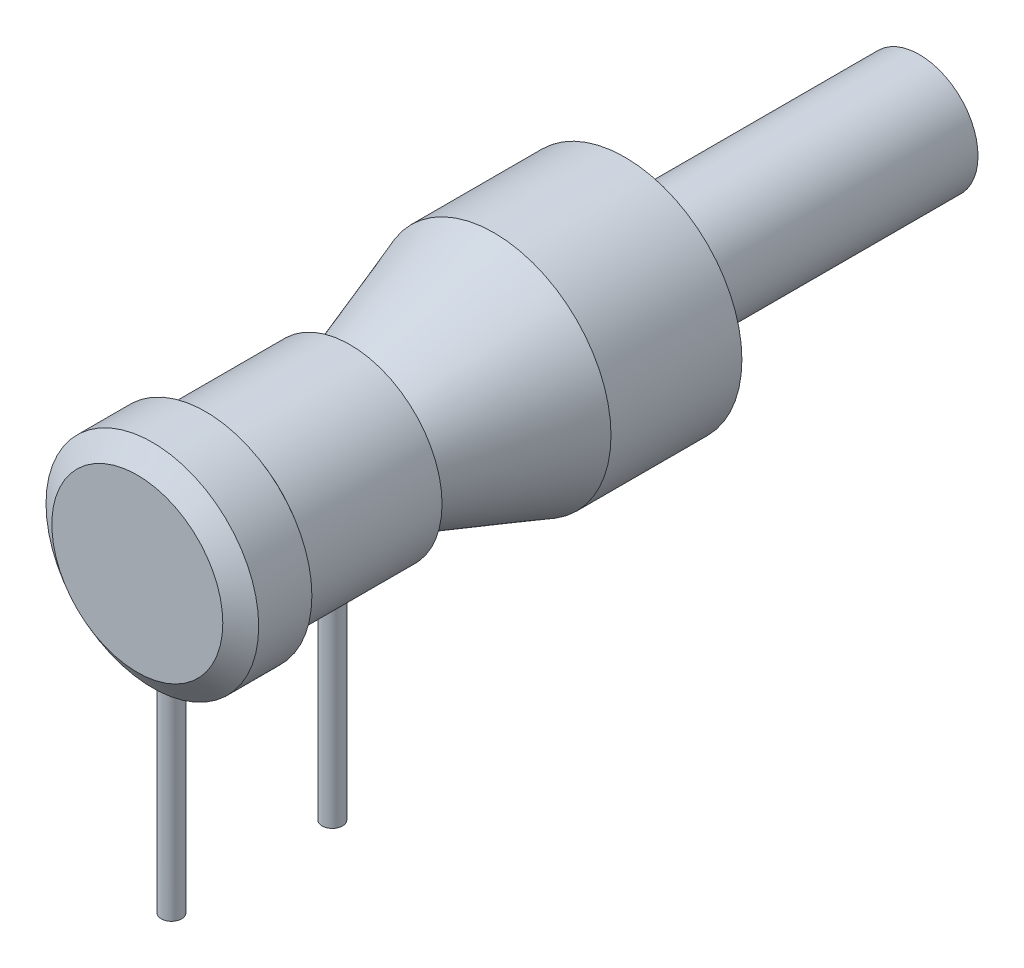
ISO-10303-21;
HEADER;
FILE_DESCRIPTION(('STEP AP214'),'2;1');
FILE_NAME('part.step','',(''),(''),'','','');
FILE_SCHEMA(('AUTOMOTIVE_DESIGN { 1 0 10303 214 1 1 1 1 }'));
ENDSEC;
DATA;
#1=APPLICATION_CONTEXT('core data for automotive mechanical design processes');
#2=APPLICATION_PROTOCOL_DEFINITION('international standard','automotive_design',2000,#1);
#3=PRODUCT_CONTEXT('',#1,'mechanical');
#4=PRODUCT('Part','Part','',(#3));
#5=PRODUCT_RELATED_PRODUCT_CATEGORY('part','',(#4));
#6=PRODUCT_DEFINITION_FORMATION('','',#4);
#7=PRODUCT_DEFINITION_CONTEXT('part definition',#1,'design');
#8=PRODUCT_DEFINITION('design','',#6,#7);
#9=PRODUCT_DEFINITION_SHAPE('','',#8);
#10=(LENGTH_UNIT() NAMED_UNIT(*) SI_UNIT(.MILLI.,.METRE.));
#11=(NAMED_UNIT(*) PLANE_ANGLE_UNIT() SI_UNIT($,.RADIAN.));
#12=(NAMED_UNIT(*) SI_UNIT($,.STERADIAN.) SOLID_ANGLE_UNIT());
#13=UNCERTAINTY_MEASURE_WITH_UNIT(LENGTH_MEASURE(1.E-05),#10,'distance_accuracy_value','');
#14=(GEOMETRIC_REPRESENTATION_CONTEXT(3) GLOBAL_UNCERTAINTY_ASSIGNED_CONTEXT((#13)) GLOBAL_UNIT_ASSIGNED_CONTEXT((#10,
#11,#12)) REPRESENTATION_CONTEXT('',''));
#15=CARTESIAN_POINT('',(0.,0.,0.));
#16=DIRECTION('',(0.,0.,1.));
#17=DIRECTION('',(1.,0.,0.));
#18=AXIS2_PLACEMENT_3D('',#15,#16,#17);
#19=CARTESIAN_POINT('',(0.,-1.97874677833909E-13,74.5));
#20=DIRECTION('',(0.,0.,-1.));
#21=DIRECTION('',(-1.,0.,0.));
#22=AXIS2_PLACEMENT_3D('',#19,#20,#21);
#23=PLANE('',#22);
#24=CARTESIAN_POINT('',(0.,0.,74.5));
#25=DIRECTION('',(0.,0.,1.));
#26=DIRECTION('',(1.,0.,0.));
#27=AXIS2_PLACEMENT_3D('',#24,#25,#26);
#28=CIRCLE('',#27,5.225);
#29=CARTESIAN_POINT('',(5.225,0.,74.5));
#30=VERTEX_POINT('',#29);
#31=EDGE_CURVE('E67',#30,#30,#28,.T.);
#32=ORIENTED_EDGE('',*,*,#31,.T.);
#33=EDGE_LOOP('',(#32));
#34=FACE_BOUND('',#33,.T.);
#35=ADVANCED_FACE('F39',(#34),#23,.F.);
#36=CARTESIAN_POINT('',(0.,0.,26.7));
#37=DIRECTION('',(0.,0.,-1.));
#38=DIRECTION('',(-1.,0.,0.));
#39=AXIS2_PLACEMENT_3D('',#36,#37,#38);
#40=PLANE('',#39);
#41=CARTESIAN_POINT('',(0.,0.,26.7));
#42=DIRECTION('',(0.,0.,1.));
#43=DIRECTION('',(1.,0.,0.));
#44=AXIS2_PLACEMENT_3D('',#41,#42,#43);
#45=CIRCLE('',#44,3.58);
#46=CARTESIAN_POINT('',(3.58,0.,26.7));
#47=VERTEX_POINT('',#46);
#48=EDGE_CURVE('E10',#47,#47,#45,.T.);
#49=ORIENTED_EDGE('',*,*,#48,.F.);
#50=EDGE_LOOP('',(#49));
#51=FACE_BOUND('',#50,.T.);
#52=ADVANCED_FACE('F98',(#51),#40,.T.);
#53=CARTESIAN_POINT('',(0.,0.,178.397679784071));
#54=DIRECTION('',(0.,0.,1.));
#55=DIRECTION('',(1.,0.,0.));
#56=AXIS2_PLACEMENT_3D('',#53,#54,#55);
#57=CYLINDRICAL_SURFACE('',#56,3.58);
#58=CARTESIAN_POINT('',(0.,0.,42.7));
#59=DIRECTION('',(0.,0.,1.));
#60=DIRECTION('',(1.,0.,0.));
#61=AXIS2_PLACEMENT_3D('',#58,#59,#60);
#62=CIRCLE('',#61,3.58);
#63=CARTESIAN_POINT('',(3.58,0.,42.7));
#64=VERTEX_POINT('',#63);
#65=EDGE_CURVE('E51',#64,#64,#62,.T.);
#66=ORIENTED_EDGE('',*,*,#65,.F.);
#67=EDGE_LOOP('',(#66));
#68=FACE_BOUND('',#67,.T.);
#69=ORIENTED_EDGE('',*,*,#48,.T.);
#70=EDGE_LOOP('',(#69));
#71=FACE_BOUND('',#70,.T.);
#72=ADVANCED_FACE('F103',(#68,#71),#57,.T.);
#73=CARTESIAN_POINT('',(0.,0.,42.7));
#74=DIRECTION('',(0.,0.,-1.));
#75=DIRECTION('',(-1.,0.,0.));
#76=AXIS2_PLACEMENT_3D('',#73,#74,#75);
#77=PLANE('',#76);
#78=CARTESIAN_POINT('',(0.,0.,42.7));
#79=DIRECTION('',(0.,0.,1.));
#80=DIRECTION('',(1.,0.,0.));
#81=AXIS2_PLACEMENT_3D('',#78,#79,#80);
#82=CIRCLE('',#81,2.25);
#83=CARTESIAN_POINT('',(2.25,0.,42.7));
#84=VERTEX_POINT('',#83);
#85=EDGE_CURVE('E58',#84,#84,#82,.T.);
#86=ORIENTED_EDGE('',*,*,#85,.F.);
#87=EDGE_LOOP('',(#86));
#88=FACE_BOUND('',#87,.T.);
#89=ORIENTED_EDGE('',*,*,#65,.T.);
#90=EDGE_LOOP('',(#89));
#91=FACE_BOUND('',#90,.T.);
#92=ADVANCED_FACE('F140',(#88,#91),#77,.F.);
#93=CARTESIAN_POINT('',(0.,0.,178.397679784071));
#94=DIRECTION('',(0.,0.,1.));
#95=DIRECTION('',(1.,0.,0.));
#96=AXIS2_PLACEMENT_3D('',#93,#94,#95);
#97=CYLINDRICAL_SURFACE('',#96,2.25);
#98=ORIENTED_EDGE('',*,*,#85,.T.);
#99=EDGE_LOOP('',(#98));
#100=FACE_BOUND('',#99,.T.);
#101=CARTESIAN_POINT('',(0.,0.,44.7));
#102=DIRECTION('',(0.,0.,1.));
#103=DIRECTION('',(1.,0.,0.));
#104=AXIS2_PLACEMENT_3D('',#101,#102,#103);
#105=CIRCLE('',#104,2.25);
#106=CARTESIAN_POINT('',(2.25,0.,44.7));
#107=VERTEX_POINT('',#106);
#108=EDGE_CURVE('E132',#107,#107,#105,.T.);
#109=ORIENTED_EDGE('',*,*,#108,.F.);
#110=EDGE_LOOP('',(#109));
#111=FACE_BOUND('',#110,.T.);
#112=ADVANCED_FACE('F137',(#100,#111),#97,.T.);
#113=CARTESIAN_POINT('',(0.,0.,44.7));
#114=DIRECTION('',(0.,0.,-1.));
#115=DIRECTION('',(-1.,0.,0.));
#116=AXIS2_PLACEMENT_3D('',#113,#114,#115);
#117=PLANE('',#116);
#118=ORIENTED_EDGE('',*,*,#108,.T.);
#119=EDGE_LOOP('',(#118));
#120=FACE_BOUND('',#119,.T.);
#121=CARTESIAN_POINT('',(0.,0.,44.7));
#122=DIRECTION('',(0.,0.,1.));
#123=DIRECTION('',(1.,0.,0.));
#124=AXIS2_PLACEMENT_3D('',#121,#122,#123);
#125=CIRCLE('',#124,7.15);
#126=CARTESIAN_POINT('',(7.15,0.,44.7));
#127=VERTEX_POINT('',#126);
#128=EDGE_CURVE('E129',#127,#127,#125,.T.);
#129=ORIENTED_EDGE('',*,*,#128,.F.);
#130=EDGE_LOOP('',(#129));
#131=FACE_BOUND('',#130,.T.);
#132=ADVANCED_FACE('F153',(#120,#131),#117,.T.);
#133=CARTESIAN_POINT('',(0.,0.,178.397679784071));
#134=DIRECTION('',(0.,0.,1.));
#135=DIRECTION('',(1.,0.,0.));
#136=AXIS2_PLACEMENT_3D('',#133,#134,#135);
#137=CYLINDRICAL_SURFACE('',#136,7.15);
#138=ORIENTED_EDGE('',*,*,#128,.T.);
#139=EDGE_LOOP('',(#138));
#140=FACE_BOUND('',#139,.T.);
#141=CARTESIAN_POINT('',(0.,0.,52.7));
#142=DIRECTION('',(0.,0.,1.));
#143=DIRECTION('',(1.,0.,0.));
#144=AXIS2_PLACEMENT_3D('',#141,#142,#143);
#145=CIRCLE('',#144,7.15000000000001);
#146=CARTESIAN_POINT('',(7.15000000000001,0.,52.7));
#147=VERTEX_POINT('',#146);
#148=EDGE_CURVE('E126',#147,#147,#145,.T.);
#149=ORIENTED_EDGE('',*,*,#148,.F.);
#150=EDGE_LOOP('',(#149));
#151=FACE_BOUND('',#150,.T.);
#152=ADVANCED_FACE('F156',(#140,#151),#137,.T.);
#153=CARTESIAN_POINT('',(0.,0.,61.5));
#154=DIRECTION('',(0.,0.,-1.));
#155=DIRECTION('',(-1.,0.,0.));
#156=AXIS2_PLACEMENT_3D('',#153,#154,#155);
#157=CONICAL_SURFACE('',#156,4.1,0.333634544994301);
#158=ORIENTED_EDGE('',*,*,#148,.T.);
#159=EDGE_LOOP('',(#158));
#160=FACE_BOUND('',#159,.T.);
#161=CARTESIAN_POINT('',(0.,0.,61.5));
#162=DIRECTION('',(0.,0.,1.));
#163=DIRECTION('',(1.,0.,0.));
#164=AXIS2_PLACEMENT_3D('',#161,#162,#163);
#165=CIRCLE('',#164,4.1);
#166=CARTESIAN_POINT('',(4.1,0.,61.5));
#167=VERTEX_POINT('',#166);
#168=EDGE_CURVE('E123',#167,#167,#165,.T.);
#169=ORIENTED_EDGE('',*,*,#168,.F.);
#170=EDGE_LOOP('',(#169));
#171=FACE_BOUND('',#170,.T.);
#172=ADVANCED_FACE('F160',(#160,#171),#157,.T.);
#173=CARTESIAN_POINT('',(0.,2.79830803337898E-13,61.5));
#174=DIRECTION('',(0.,0.,1.));
#175=DIRECTION('',(1.,0.,0.));
#176=AXIS2_PLACEMENT_3D('',#173,#174,#175);
#177=PLANE('',#176);
#178=CARTESIAN_POINT('',(0.,0.,61.5));
#179=DIRECTION('',(0.,0.,1.));
#180=DIRECTION('',(1.,0.,0.));
#181=AXIS2_PLACEMENT_3D('',#178,#179,#180);
#182=CIRCLE('',#181,5.625);
#183=CARTESIAN_POINT('',(5.625,0.,61.5));
#184=VERTEX_POINT('',#183);
#185=EDGE_CURVE('E120',#184,#184,#182,.T.);
#186=ORIENTED_EDGE('',*,*,#185,.F.);
#187=EDGE_LOOP('',(#186));
#188=FACE_BOUND('',#187,.T.);
#189=ORIENTED_EDGE('',*,*,#168,.T.);
#190=EDGE_LOOP('',(#189));
#191=FACE_BOUND('',#190,.T.);
#192=ADVANCED_FACE('F93',(#188,#191),#177,.F.);
#193=CARTESIAN_POINT('',(0.,0.,178.397679784071));
#194=DIRECTION('',(0.,0.,1.));
#195=DIRECTION('',(1.,0.,0.));
#196=AXIS2_PLACEMENT_3D('',#193,#194,#195);
#197=CYLINDRICAL_SURFACE('',#196,5.625);
#198=CARTESIAN_POINT('',(0.,-5.625,63.2055494612907));
#199=CARTESIAN_POINT('',(0.0349908226092249,-5.62499955798236,63.2055479572822));
#200=CARTESIAN_POINT('',(0.070004250927972,-5.62467004409525,63.2026011034454));
#201=CARTESIAN_POINT('',(0.139058898077095,-5.6233872373631,63.1908908586582));
#202=CARTESIAN_POINT('',(0.173099027849309,-5.62243327227234,63.1821211990873));
#203=CARTESIAN_POINT('',(0.239197212209467,-5.62000915856009,63.1590251002963));
#204=CARTESIAN_POINT('',(0.271256506480509,-5.61853933670987,63.1447021782096));
#205=CARTESIAN_POINT('',(0.332509540656205,-5.61524749408966,63.1109133318537));
#206=CARTESIAN_POINT('',(0.361703816167155,-5.61342553933965,63.0914483713941));
#207=CARTESIAN_POINT('',(0.416533049209455,-5.60962428693299,63.0478363206257));
#208=CARTESIAN_POINT('',(0.442153618606902,-5.60764440098013,63.023671191023));
#209=CARTESIAN_POINT('',(0.488984386593904,-5.60375524476677,62.9713833750293));
#210=CARTESIAN_POINT('',(0.510194372810079,-5.60184597791027,62.9432604981787));
#211=CARTESIAN_POINT('',(0.547654068175719,-5.59830833734177,62.8837638587188));
#212=CARTESIAN_POINT('',(0.563890548569808,-5.59668071767983,62.8523817184627));
#213=CARTESIAN_POINT('',(0.590857868127484,-5.59389818136035,62.787315254826));
#214=CARTESIAN_POINT('',(0.601588873443673,-5.59274325043749,62.753631000957));
#215=CARTESIAN_POINT('',(0.617197482789511,-5.59104232572351,62.6850644619581));
#216=CARTESIAN_POINT('',(0.622099155756928,-5.59049382867092,62.6501877190811));
#217=CARTESIAN_POINT('',(0.625984393760957,-5.59006015831635,62.5801026294688));
#218=CARTESIAN_POINT('',(0.62496814863901,-5.59017496373623,62.544894293407));
#219=CARTESIAN_POINT('',(0.61706620133719,-5.59105263781687,62.4753121253621));
#220=CARTESIAN_POINT('',(0.610206875540539,-5.59181259413467,62.4409352560799));
#221=CARTESIAN_POINT('',(0.590854566117779,-5.59389039741689,62.3738236408567));
#222=CARTESIAN_POINT('',(0.578361490406725,-5.59520825350031,62.3410889217668));
#223=CARTESIAN_POINT('',(0.548067518998285,-5.59825670078246,62.2781080790522));
#224=CARTESIAN_POINT('',(0.530255021504622,-5.59998819246254,62.2478675812858));
#225=CARTESIAN_POINT('',(0.489836158323981,-5.60366808509973,62.1907951954373));
#226=CARTESIAN_POINT('',(0.46722961930248,-5.60561649389853,62.1639634306584));
#227=CARTESIAN_POINT('',(0.417717546543613,-5.60952365306027,62.1143169661943));
#228=CARTESIAN_POINT('',(0.390789251771329,-5.61148240190408,62.091524959658));
#229=CARTESIAN_POINT('',(0.3334768187378,-5.61517955344319,62.0507812170181));
#230=CARTESIAN_POINT('',(0.303092675086573,-5.6169179557948,62.0328294884639));
#231=CARTESIAN_POINT('',(0.239714573604846,-5.619979315706,62.0022764098017));
#232=CARTESIAN_POINT('',(0.206720001500533,-5.62130217511578,61.989676323486));
#233=CARTESIAN_POINT('',(0.139065548637299,-5.62338245156652,61.9702014065902));
#234=CARTESIAN_POINT('',(0.104405729455595,-5.62413988949844,61.9633263644825));
#235=CARTESIAN_POINT('',(0.0346010412169575,-5.62500128457988,61.955525742004));
#236=CARTESIAN_POINT('',(-0.000540290278405599,-5.62510867875279,61.9545688694794));
#237=CARTESIAN_POINT('',(-0.070482808964739,-5.62466712876343,61.958549396451));
#238=CARTESIAN_POINT('',(-0.105284001841038,-5.62411819559048,61.9634866972573));
#239=CARTESIAN_POINT('',(-0.173467206069793,-5.62242784165784,61.9790894426832));
#240=CARTESIAN_POINT('',(-0.206852637050577,-5.6212879482682,61.9897401232024));
#241=CARTESIAN_POINT('',(-0.271363209414658,-5.61854343856761,62.0164520480807));
#242=CARTESIAN_POINT('',(-0.302488288997594,-5.61693880955629,62.0325134403067));
#243=CARTESIAN_POINT('',(-0.361735395349206,-5.61343549063211,62.0696676772504));
#244=CARTESIAN_POINT('',(-0.389844541059695,-5.61153561813629,62.0907809490844));
#245=CARTESIAN_POINT('',(-0.442131198375686,-5.60765848704489,62.1374104920202));
#246=CARTESIAN_POINT('',(-0.466308587548617,-5.60568122604187,62.1629269001821));
#247=CARTESIAN_POINT('',(-0.510155070102551,-5.60186171376125,62.2177754891239));
#248=CARTESIAN_POINT('',(-0.529803539181003,-5.60002010513343,62.2471242083152));
#249=CARTESIAN_POINT('',(-0.563892362515651,-5.59669054022848,62.3087232998821));
#250=CARTESIAN_POINT('',(-0.578332802187735,-5.5952025781514,62.3409736246582));
#251=CARTESIAN_POINT('',(-0.601561600316074,-5.59275296320827,62.4073914796397));
#252=CARTESIAN_POINT('',(-0.610361960878524,-5.5917901933861,62.4415547693368));
#253=CARTESIAN_POINT('',(-0.62209961802124,-5.59049662367049,62.51088544496));
#254=CARTESIAN_POINT('',(-0.625037126002046,-5.59016580099056,62.5460527946355));
#255=CARTESIAN_POINT('',(-0.624962366692746,-5.59017414327079,62.6161882597485));
#256=CARTESIAN_POINT('',(-0.621982497009557,-5.59050966002772,62.6511564146285));
#257=CARTESIAN_POINT('',(-0.610225781501503,-5.59180507174084,62.7200918795174));
#258=CARTESIAN_POINT('',(-0.601448931364732,-5.59276496716146,62.754059188782));
#259=CARTESIAN_POINT('',(-0.578356847695511,-5.59519992034723,62.8200268083248));
#260=CARTESIAN_POINT('',(-0.564042824806855,-5.59667486549539,62.8520275468018));
#261=CARTESIAN_POINT('',(-0.530285964960163,-5.59997394125645,62.9131777404933));
#262=CARTESIAN_POINT('',(-0.510843117574251,-5.6017980725793,62.9423271899104));
#263=CARTESIAN_POINT('',(-0.467259360167837,-5.60560196231319,62.9971132882052));
#264=CARTESIAN_POINT('',(-0.44309428406349,-5.60758248861688,63.0227306598769));
#265=CARTESIAN_POINT('',(-0.390801310151285,-5.61146908169291,63.0695600463566));
#266=CARTESIAN_POINT('',(-0.362672471127032,-5.6133751306425,63.0907710118717));
#267=CARTESIAN_POINT('',(-0.303154527117145,-5.61690422530215,63.1282383145251));
#268=CARTESIAN_POINT('',(-0.271755764505024,-5.61852639245963,63.1444793830816));
#269=CARTESIAN_POINT('',(-0.20667765473788,-5.62129573572989,63.1714361776797));
#270=CARTESIAN_POINT('',(-0.173000887482635,-5.62244343904236,63.1821580396452));
#271=CARTESIAN_POINT('',(-0.115950074785185,-5.62385101726845,63.1951429492488));
#272=CARTESIAN_POINT('',(-0.0929387921441738,-5.62427983937615,63.199039945178));
#273=CARTESIAN_POINT('',(-0.0466216843445947,-5.62485447724675,63.2042436953107));
#274=CARTESIAN_POINT('',(-0.0233158607742202,-5.62500029453499,63.205550463475));
#275=CARTESIAN_POINT('',(0.,-5.625,63.2055494612907));
#276=B_SPLINE_CURVE_WITH_KNOTS('',3,(#198,#199,#200,#201,#202,#203,#204,#205,#206,#207,#208,
#209,#210,#211,#212,#213,#214,#215,#216,#217,#218,#219,#220,#221,#222,#223,#224,#225,#226,#227,
#228,#229,#230,#231,#232,#233,#234,#235,#236,#237,#238,#239,#240,#241,#242,#243,#244,#245,#246,
#247,#248,#249,#250,#251,#252,#253,#254,#255,#256,#257,#258,#259,#260,#261,#262,#263,#264,#265,
#266,#267,#268,#269,#270,#271,#272,#273,#274,#275),.UNSPECIFIED.,.T.,.F.,(4,2,2,2,2,2,2,2,2,2,2,
2,2,2,2,2,2,2,2,2,2,2,2,2,2,2,2,2,2,2,2,2,2,2,2,2,2,2,4),(0.,0.104887316959628,
0.209887735262184,0.314821760375238,0.419736130880362,0.525061405576138,0.630391750600922,
0.735999872831949,0.841604807672926,0.946772175688268,1.05193617004848,1.1566279416973,
1.26132142461932,1.36624493541567,1.47117224049881,1.57667147666654,1.6821708773805,
1.78769517798315,1.89321557952533,1.99817756459502,2.10313779224162,2.20782808674814,
2.31252124251959,2.41764509652388,2.52277222339619,2.62836902674331,2.7339640981388,
2.83933371016292,2.94469952274044,3.04949004856204,3.15428065232898,3.25904835768518,
3.36381627605569,3.46913509208248,3.57447895889155,3.68014328839558,3.78568989152487,
3.85558111093266,3.92547195364087),.UNSPECIFIED.);
#277=CARTESIAN_POINT('',(0.,-5.625,63.2055494612907));
#278=VERTEX_POINT('',#277);
#279=EDGE_CURVE('E61',#278,#278,#276,.T.);
#280=ORIENTED_EDGE('',*,*,#279,.T.);
#281=EDGE_LOOP('',(#280));
#282=FACE_BOUND('',#281,.T.);
#283=CARTESIAN_POINT('',(0.,0.,69.7));
#284=DIRECTION('',(0.,0.,1.));
#285=DIRECTION('',(1.,0.,0.));
#286=AXIS2_PLACEMENT_3D('',#283,#284,#285);
#287=CIRCLE('',#286,5.625);
#288=CARTESIAN_POINT('',(5.625,0.,69.7));
#289=VERTEX_POINT('',#288);
#290=EDGE_CURVE('E117',#289,#289,#287,.T.);
#291=ORIENTED_EDGE('',*,*,#290,.F.);
#292=EDGE_LOOP('',(#291));
#293=FACE_BOUND('',#292,.T.);
#294=ORIENTED_EDGE('',*,*,#185,.T.);
#295=EDGE_LOOP('',(#294));
#296=FACE_BOUND('',#295,.T.);
#297=ADVANCED_FACE('F69',(#282,#293,#296),#197,.T.);
#298=CARTESIAN_POINT('',(0.,0.,69.7));
#299=DIRECTION('',(0.,0.,1.));
#300=DIRECTION('',(1.,0.,0.));
#301=AXIS2_PLACEMENT_3D('',#298,#299,#300);
#302=CONICAL_SURFACE('',#301,5.625,0.946160904023289);
#303=CARTESIAN_POINT('',(0.,0.,70.3308139534884));
#304=DIRECTION('',(0.,0.,1.));
#305=DIRECTION('',(1.,0.,0.));
#306=AXIS2_PLACEMENT_3D('',#303,#304,#305);
#307=CIRCLE('',#306,6.5);
#308=CARTESIAN_POINT('',(6.5,0.,70.3308139534884));
#309=VERTEX_POINT('',#308);
#310=EDGE_CURVE('E110',#309,#309,#307,.T.);
#311=ORIENTED_EDGE('',*,*,#310,.F.);
#312=EDGE_LOOP('',(#311));
#313=FACE_BOUND('',#312,.T.);
#314=ORIENTED_EDGE('',*,*,#290,.T.);
#315=EDGE_LOOP('',(#314));
#316=FACE_BOUND('',#315,.T.);
#317=ADVANCED_FACE('F86',(#313,#316),#302,.T.);
#318=CARTESIAN_POINT('',(0.,0.,178.397679784071));
#319=DIRECTION('',(0.,0.,1.));
#320=DIRECTION('',(1.,0.,0.));
#321=AXIS2_PLACEMENT_3D('',#318,#319,#320);
#322=CYLINDRICAL_SURFACE('',#321,6.5);
#323=CARTESIAN_POINT('',(0.,-6.5,73.0386028651874));
#324=CARTESIAN_POINT('',(0.0350197727136685,-6.49999961094764,73.0386013453012));
#325=CARTESIAN_POINT('',(0.070062868356343,-6.4997139785287,73.0356496350745));
#326=CARTESIAN_POINT('',(0.139178011986377,-6.49860199938059,73.0239189713794));
#327=CARTESIAN_POINT('',(0.173248938882113,-6.49777505278363,73.0151335530184));
#328=CARTESIAN_POINT('',(0.239408846693688,-6.49567381778745,72.991993171749));
#329=CARTESIAN_POINT('',(0.271498992887883,-6.49439979540656,72.9776415203185));
#330=CARTESIAN_POINT('',(0.332807731942918,-6.49154696953135,72.9437823703318));
#331=CARTESIAN_POINT('',(0.362026904813242,-6.48996822778991,72.9242759161269));
#332=CARTESIAN_POINT('',(0.416869029986982,-6.48667699110844,72.8805908665088));
#333=CARTESIAN_POINT('',(0.442481052443908,-6.48496411313333,72.8563985773775));
#334=CARTESIAN_POINT('',(0.489287940931411,-6.48160083462511,72.8040577413497));
#335=CARTESIAN_POINT('',(0.510482605249372,-6.4799504369479,72.775909013886));
#336=CARTESIAN_POINT('',(0.547891471713696,-6.47689502480807,72.7163864229962));
#337=CARTESIAN_POINT('',(0.564095846522496,-6.47549049685138,72.6850063561531));
#338=CARTESIAN_POINT('',(0.591001396083436,-6.47309052044968,72.6199549185404));
#339=CARTESIAN_POINT('',(0.601702697184028,-6.47209506261268,72.5862836003971));
#340=CARTESIAN_POINT('',(0.617266079853162,-6.47062934599529,72.517716516881));
#341=CARTESIAN_POINT('',(0.622146220444041,-6.47015746324441,72.4828248858458));
#342=CARTESIAN_POINT('',(0.625984568314021,-6.46978726370531,72.4127148342914));
#343=CARTESIAN_POINT('',(0.624942920236977,-6.46988893290768,72.3774964217749));
#344=CARTESIAN_POINT('',(0.616982153654872,-6.47065286849291,72.3078568349423));
#345=CARTESIAN_POINT('',(0.610082730434612,-6.47131325629996,72.2734333856825));
#346=CARTESIAN_POINT('',(0.590632896765135,-6.47311728290921,72.2062353213415));
#347=CARTESIAN_POINT('',(0.578082415171259,-6.47426092779544,72.1734607270246));
#348=CARTESIAN_POINT('',(0.547664910150385,-6.47690477094735,72.11042837102));
#349=CARTESIAN_POINT('',(0.529789124368904,-6.47840555603288,72.0801748633927));
#350=CARTESIAN_POINT('',(0.489234740109573,-6.48159407223194,72.0230900105392));
#351=CARTESIAN_POINT('',(0.466556011731898,-6.48328180840115,71.9962587579025));
#352=CARTESIAN_POINT('',(0.416929391069494,-6.48666242976938,71.9466655902035));
#353=CARTESIAN_POINT('',(0.389964485142721,-6.48835530793871,71.9239206963057));
#354=CARTESIAN_POINT('',(0.332590090601741,-6.49154896311143,71.8832777374918));
#355=CARTESIAN_POINT('',(0.302180598553638,-6.49304973992332,71.8653796774075));
#356=CARTESIAN_POINT('',(0.23876863246625,-6.4956905349884,71.8349392221476));
#357=CARTESIAN_POINT('',(0.205765754368832,-6.49683049688578,71.8223976634993));
#358=CARTESIAN_POINT('',(0.138109287961956,-6.49862062862218,71.8030385568335));
#359=CARTESIAN_POINT('',(0.103455745310827,-6.49927081200042,71.7962208505879));
#360=CARTESIAN_POINT('',(0.0336290732358602,-6.50000638997466,71.7885245094344));
#361=CARTESIAN_POINT('',(-0.0015414441669458,-6.50009401871053,71.7876223809854));
#362=CARTESIAN_POINT('',(-0.0715331830185977,-6.49970059885423,71.7917211379003));
#363=CARTESIAN_POINT('',(-0.106354408819145,-6.49921955735583,71.7967219496292));
#364=CARTESIAN_POINT('',(-0.174591511252997,-6.49774429546215,71.8124651461372));
#365=CARTESIAN_POINT('',(-0.208009942484155,-6.49675105594605,71.823196557984));
#366=CARTESIAN_POINT('',(-0.272572168635438,-6.49436286222032,71.8500850698283));
#367=CARTESIAN_POINT('',(-0.303715916202042,-6.49296789965076,71.8662422827389));
#368=CARTESIAN_POINT('',(-0.362951111559569,-6.48992681187426,71.9035822080052));
#369=CARTESIAN_POINT('',(-0.391032769255934,-6.48827991932635,71.9247803876498));
#370=CARTESIAN_POINT('',(-0.443247617500805,-6.48492231593688,71.9715782896192));
#371=CARTESIAN_POINT('',(-0.46738071650633,-6.48321160361686,71.9971781139631));
#372=CARTESIAN_POINT('',(-0.511094727194352,-6.4799124728101,72.0521549923289));
#373=CARTESIAN_POINT('',(-0.53066024156594,-6.47832447970681,72.0815443183937));
#374=CARTESIAN_POINT('',(-0.564577909667,-6.4754569525029,72.1432052790676));
#375=CARTESIAN_POINT('',(-0.578930130012276,-6.47417741446088,72.1754768768402));
#376=CARTESIAN_POINT('',(-0.601987914857158,-6.47207426579542,72.2419330815609));
#377=CARTESIAN_POINT('',(-0.610702705803655,-6.47124991052676,72.2761144627418));
#378=CARTESIAN_POINT('',(-0.622268213354836,-6.47014810957771,72.3454636612341));
#379=CARTESIAN_POINT('',(-0.625119084340666,-6.46987064949907,72.3806314525513));
#380=CARTESIAN_POINT('',(-0.624873773721708,-6.46989433505183,72.4508021557285));
#381=CARTESIAN_POINT('',(-0.621801780296884,-6.47019312734772,72.4858051554628));
#382=CARTESIAN_POINT('',(-0.60984859054444,-6.47133063787673,72.5547954295981));
#383=CARTESIAN_POINT('',(-0.600967387048516,-6.47216935677609,72.5887827027458));
#384=CARTESIAN_POINT('',(-0.577654425478192,-6.47429157365824,72.6547769912714));
#385=CARTESIAN_POINT('',(-0.563223311839793,-6.47557501999913,72.6867842360626));
#386=CARTESIAN_POINT('',(-0.529222712332255,-6.47844218263753,72.7479259669461));
#387=CARTESIAN_POINT('',(-0.509653267963747,-6.48002589650984,72.777060476238));
#388=CARTESIAN_POINT('',(-0.46584061353576,-6.48332288703883,72.8317536639129));
#389=CARTESIAN_POINT('',(-0.441579397379423,-6.48503664687368,72.857297889425));
#390=CARTESIAN_POINT('',(-0.389106974259878,-6.48839621229216,72.9039635951531));
#391=CARTESIAN_POINT('',(-0.360894820260934,-6.49004200146046,72.9250840119487));
#392=CARTESIAN_POINT('',(-0.301249528036619,-6.4930841576708,72.962340974555));
#393=CARTESIAN_POINT('',(-0.269808966053061,-6.49447992862873,72.9784656747655));
#394=CARTESIAN_POINT('',(-0.204673550223575,-6.49685819921474,73.0051856212745));
#395=CARTESIAN_POINT('',(-0.170981299479937,-6.49784116680927,73.0157871321273));
#396=CARTESIAN_POINT('',(-0.114246911410105,-6.49903476287124,73.0285022722605));
#397=CARTESIAN_POINT('',(-0.0915680115331598,-6.4993950488378,73.0322848542894));
#398=CARTESIAN_POINT('',(-0.0459294183569157,-6.49987779454825,73.0373356444995));
#399=CARTESIAN_POINT('',(-0.0229697261089246,-6.5000002551823,73.0386038620919));
#400=CARTESIAN_POINT('',(0.,-6.5,73.0386028651874));
#401=B_SPLINE_CURVE_WITH_KNOTS('',3,(#323,#324,#325,#326,#327,#328,#329,#330,#331,#332,#333,
#334,#335,#336,#337,#338,#339,#340,#341,#342,#343,#344,#345,#346,#347,#348,#349,#350,#351,#352,
#353,#354,#355,#356,#357,#358,#359,#360,#361,#362,#363,#364,#365,#366,#367,#368,#369,#370,#371,
#372,#373,#374,#375,#376,#377,#378,#379,#380,#381,#382,#383,#384,#385,#386,#387,#388,#389,#390,
#391,#392,#393,#394,#395,#396,#397,#398,#399,#400),.UNSPECIFIED.,.T.,.F.,(4,2,2,2,2,2,2,2,2,2,2,
2,2,2,2,2,2,2,2,2,2,2,2,2,2,2,2,2,2,2,2,2,2,2,2,2,2,2,4),(0.,0.104975444343014,0.21006741664647,
0.315096963024924,0.420105246952169,0.525425164029086,0.630749889342758,0.736280722678384,
0.84180913295856,0.947009303200178,1.05220690386464,1.15705219859719,1.2618988133287,
1.36691890655011,1.47194184049555,1.57739257302346,1.68284341067576,1.78831071061761,
1.89377509496558,1.99882037565331,2.10386434598932,2.20870789597463,2.31355362793238,
2.41872530791893,2.52389942584958,2.62942312456509,2.73494547484463,2.84029468304588,
2.945641117652,3.05055824275367,3.15547549731857,3.26038057293824,3.36528480129969,
3.47059992115467,3.57594032828114,3.681528634881,3.78699691812718,3.85585134073123,
3.92470550561794),.UNSPECIFIED.);
#402=CARTESIAN_POINT('',(0.,-6.5,73.0386028651874));
#403=VERTEX_POINT('',#402);
#404=EDGE_CURVE('E42',#403,#403,#401,.T.);
#405=ORIENTED_EDGE('',*,*,#404,.T.);
#406=EDGE_LOOP('',(#405));
#407=FACE_BOUND('',#406,.T.);
#408=CARTESIAN_POINT('',(0.,0.,73.5808139534884));
#409=DIRECTION('',(0.,0.,1.));
#410=DIRECTION('',(1.,0.,0.));
#411=AXIS2_PLACEMENT_3D('',#408,#409,#410);
#412=CIRCLE('',#411,6.5);
#413=CARTESIAN_POINT('',(6.5,0.,73.5808139534884));
#414=VERTEX_POINT('',#413);
#415=EDGE_CURVE('E107',#414,#414,#412,.T.);
#416=ORIENTED_EDGE('',*,*,#415,.F.);
#417=EDGE_LOOP('',(#416));
#418=FACE_BOUND('',#417,.T.);
#419=ORIENTED_EDGE('',*,*,#310,.T.);
#420=EDGE_LOOP('',(#419));
#421=FACE_BOUND('',#420,.T.);
#422=ADVANCED_FACE('F82',(#407,#418,#421),#322,.T.);
#423=CARTESIAN_POINT('',(0.,0.,73.5808139534884));
#424=DIRECTION('',(0.,0.,-1.));
#425=DIRECTION('',(-1.,0.,0.));
#426=AXIS2_PLACEMENT_3D('',#423,#424,#425);
#427=CONICAL_SURFACE('',#426,6.5,0.946160904023282);
#428=ORIENTED_EDGE('',*,*,#31,.F.);
#429=EDGE_LOOP('',(#428));
#430=FACE_BOUND('',#429,.T.);
#431=ORIENTED_EDGE('',*,*,#415,.T.);
#432=EDGE_LOOP('',(#431));
#433=FACE_BOUND('',#432,.T.);
#434=ADVANCED_FACE('F79',(#430,#433),#427,.T.);
#435=CARTESIAN_POINT('',(0.,-19.,62.5805494612907));
#436=DIRECTION('',(0.,1.,0.));
#437=DIRECTION('',(0.,0.,1.));
#438=AXIS2_PLACEMENT_3D('',#435,#436,#437);
#439=CYLINDRICAL_SURFACE('',#438,0.625);
#440=CARTESIAN_POINT('',(0.,-19.,62.5805494612907));
#441=DIRECTION('',(0.,1.,0.));
#442=DIRECTION('',(0.,0.,1.));
#443=AXIS2_PLACEMENT_3D('',#440,#441,#442);
#444=CIRCLE('',#443,0.625);
#445=CARTESIAN_POINT('',(0.,-19.,63.2055494612907));
#446=VERTEX_POINT('',#445);
#447=EDGE_CURVE('E68',#446,#446,#444,.T.);
#448=ORIENTED_EDGE('',*,*,#447,.T.);
#449=EDGE_LOOP('',(#448));
#450=FACE_BOUND('',#449,.T.);
#451=ORIENTED_EDGE('',*,*,#279,.F.);
#452=EDGE_LOOP('',(#451));
#453=FACE_BOUND('',#452,.T.);
#454=ADVANCED_FACE('F73',(#450,#453),#439,.T.);
#455=CARTESIAN_POINT('',(0.,-19.,62.5805494612907));
#456=DIRECTION('',(0.,1.,0.));
#457=DIRECTION('',(0.,0.,1.));
#458=AXIS2_PLACEMENT_3D('',#455,#456,#457);
#459=PLANE('',#458);
#460=ORIENTED_EDGE('',*,*,#447,.F.);
#461=EDGE_LOOP('',(#460));
#462=FACE_BOUND('',#461,.T.);
#463=ADVANCED_FACE('F78',(#462),#459,.F.);
#464=CARTESIAN_POINT('',(0.,-19.,72.4136028651874));
#465=DIRECTION('',(0.,1.,0.));
#466=DIRECTION('',(0.,0.,1.));
#467=AXIS2_PLACEMENT_3D('',#464,#465,#466);
#468=CYLINDRICAL_SURFACE('',#467,0.625);
#469=CARTESIAN_POINT('',(0.,-19.,72.4136028651874));
#470=DIRECTION('',(0.,1.,0.));
#471=DIRECTION('',(0.,0.,1.));
#472=AXIS2_PLACEMENT_3D('',#469,#470,#471);
#473=CIRCLE('',#472,0.625);
#474=CARTESIAN_POINT('',(0.,-19.,73.0386028651874));
#475=VERTEX_POINT('',#474);
#476=EDGE_CURVE('E229',#475,#475,#473,.T.);
#477=ORIENTED_EDGE('',*,*,#476,.T.);
#478=EDGE_LOOP('',(#477));
#479=FACE_BOUND('',#478,.T.);
#480=ORIENTED_EDGE('',*,*,#404,.F.);
#481=EDGE_LOOP('',(#480));
#482=FACE_BOUND('',#481,.T.);
#483=ADVANCED_FACE('F204',(#479,#482),#468,.T.);
#484=CARTESIAN_POINT('',(0.,-19.,72.4136028651874));
#485=DIRECTION('',(0.,1.,0.));
#486=DIRECTION('',(0.,0.,1.));
#487=AXIS2_PLACEMENT_3D('',#484,#485,#486);
#488=PLANE('',#487);
#489=ORIENTED_EDGE('',*,*,#476,.F.);
#490=EDGE_LOOP('',(#489));
#491=FACE_BOUND('',#490,.T.);
#492=ADVANCED_FACE('F213',(#491),#488,.F.);
#493=CLOSED_SHELL('',(#35,#52,#72,#92,#112,#132,#152,#172,#192,#297,#317,#422,#434,#454,#463,
#483,#492));
#494=MANIFOLD_SOLID_BREP('B2',#493);
#495=ADVANCED_BREP_SHAPE_REPRESENTATION('',(#18,#494),#14);
#496=SHAPE_DEFINITION_REPRESENTATION(#9,#495);
ENDSEC;
END-ISO-10303-21;
